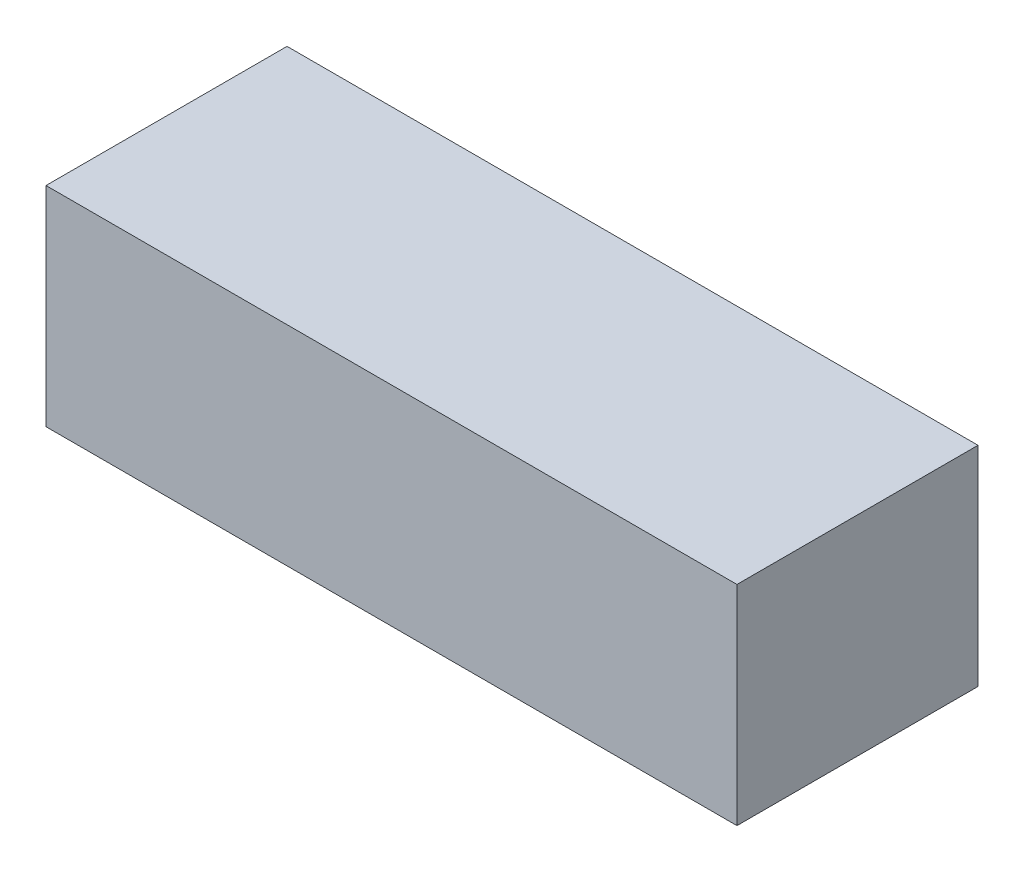
ISO-10303-21;
HEADER;
FILE_DESCRIPTION(('STEP AP214'),'2;1');
FILE_NAME('part.step','',(''),(''),'','','');
FILE_SCHEMA(('AUTOMOTIVE_DESIGN { 1 0 10303 214 1 1 1 1 }'));
ENDSEC;
DATA;
#1=APPLICATION_CONTEXT('core data for automotive mechanical design processes');
#2=APPLICATION_PROTOCOL_DEFINITION('international standard','automotive_design',2000,#1);
#3=PRODUCT_CONTEXT('',#1,'mechanical');
#4=PRODUCT('Part','Part','',(#3));
#5=PRODUCT_RELATED_PRODUCT_CATEGORY('part','',(#4));
#6=PRODUCT_DEFINITION_FORMATION('','',#4);
#7=PRODUCT_DEFINITION_CONTEXT('part definition',#1,'design');
#8=PRODUCT_DEFINITION('design','',#6,#7);
#9=PRODUCT_DEFINITION_SHAPE('','',#8);
#10=(LENGTH_UNIT() NAMED_UNIT(*) SI_UNIT(.MILLI.,.METRE.));
#11=(NAMED_UNIT(*) PLANE_ANGLE_UNIT() SI_UNIT($,.RADIAN.));
#12=(NAMED_UNIT(*) SI_UNIT($,.STERADIAN.) SOLID_ANGLE_UNIT());
#13=UNCERTAINTY_MEASURE_WITH_UNIT(LENGTH_MEASURE(1.E-05),#10,'distance_accuracy_value','');
#14=(GEOMETRIC_REPRESENTATION_CONTEXT(3) GLOBAL_UNCERTAINTY_ASSIGNED_CONTEXT((#13)) GLOBAL_UNIT_ASSIGNED_CONTEXT((#10,
#11,#12)) REPRESENTATION_CONTEXT('',''));
#15=CARTESIAN_POINT('',(0.,0.,0.));
#16=DIRECTION('',(0.,0.,1.));
#17=DIRECTION('',(1.,0.,0.));
#18=AXIS2_PLACEMENT_3D('',#15,#16,#17);
#19=CARTESIAN_POINT('',(215.,65.,75.));
#20=DIRECTION('',(-1.,0.,0.));
#21=DIRECTION('',(0.,0.,1.));
#22=AXIS2_PLACEMENT_3D('',#19,#20,#21);
#23=PLANE('',#22);
#24=DIRECTION('',(0.,0.,-1.));
#25=VECTOR('',#24,1.);
#26=CARTESIAN_POINT('',(215.,-65.,75.));
#27=LINE('',#26,#25);
#28=CARTESIAN_POINT('',(215.,-65.,75.));
#29=VERTEX_POINT('',#28);
#30=CARTESIAN_POINT('',(215.,-65.,-75.));
#31=VERTEX_POINT('',#30);
#32=EDGE_CURVE('E102',#29,#31,#27,.T.);
#33=ORIENTED_EDGE('',*,*,#32,.T.);
#34=DIRECTION('',(0.,-1.,0.));
#35=VECTOR('',#34,1.);
#36=CARTESIAN_POINT('',(215.,65.,-75.));
#37=LINE('',#36,#35);
#38=CARTESIAN_POINT('',(215.,65.,-75.));
#39=VERTEX_POINT('',#38);
#40=EDGE_CURVE('E11',#39,#31,#37,.T.);
#41=ORIENTED_EDGE('',*,*,#40,.F.);
#42=DIRECTION('',(0.,0.,-1.));
#43=VECTOR('',#42,1.);
#44=CARTESIAN_POINT('',(215.,65.,75.));
#45=LINE('',#44,#43);
#46=CARTESIAN_POINT('',(215.,65.,75.));
#47=VERTEX_POINT('',#46);
#48=EDGE_CURVE('E90',#47,#39,#45,.T.);
#49=ORIENTED_EDGE('',*,*,#48,.F.);
#50=DIRECTION('',(0.,-1.,0.));
#51=VECTOR('',#50,1.);
#52=CARTESIAN_POINT('',(215.,65.,75.));
#53=LINE('',#52,#51);
#54=EDGE_CURVE('E98',#47,#29,#53,.T.);
#55=ORIENTED_EDGE('',*,*,#54,.T.);
#56=EDGE_LOOP('',(#33,#41,#49,#55));
#57=FACE_BOUND('',#56,.T.);
#58=ADVANCED_FACE('F39',(#57),#23,.F.);
#59=CARTESIAN_POINT('',(-215.,65.,-75.));
#60=DIRECTION('',(0.,0.,1.));
#61=DIRECTION('',(1.,0.,0.));
#62=AXIS2_PLACEMENT_3D('',#59,#60,#61);
#63=PLANE('',#62);
#64=DIRECTION('',(-1.,0.,0.));
#65=VECTOR('',#64,1.);
#66=CARTESIAN_POINT('',(-215.,-65.,-75.));
#67=LINE('',#66,#65);
#68=CARTESIAN_POINT('',(-215.,-65.,-75.));
#69=VERTEX_POINT('',#68);
#70=EDGE_CURVE('E94',#31,#69,#67,.T.);
#71=ORIENTED_EDGE('',*,*,#70,.T.);
#72=DIRECTION('',(0.,-1.,0.));
#73=VECTOR('',#72,1.);
#74=CARTESIAN_POINT('',(-215.,65.,-75.));
#75=LINE('',#74,#73);
#76=CARTESIAN_POINT('',(-215.,65.,-75.));
#77=VERTEX_POINT('',#76);
#78=EDGE_CURVE('E47',#77,#69,#75,.T.);
#79=ORIENTED_EDGE('',*,*,#78,.F.);
#80=DIRECTION('',(-1.,0.,0.));
#81=VECTOR('',#80,1.);
#82=CARTESIAN_POINT('',(-215.,65.,-75.));
#83=LINE('',#82,#81);
#84=EDGE_CURVE('E85',#39,#77,#83,.T.);
#85=ORIENTED_EDGE('',*,*,#84,.F.);
#86=ORIENTED_EDGE('',*,*,#40,.T.);
#87=EDGE_LOOP('',(#71,#79,#85,#86));
#88=FACE_BOUND('',#87,.T.);
#89=ADVANCED_FACE('F93',(#88),#63,.F.);
#90=CARTESIAN_POINT('',(-215.,65.,75.));
#91=DIRECTION('',(1.,0.,0.));
#92=DIRECTION('',(0.,0.,-1.));
#93=AXIS2_PLACEMENT_3D('',#90,#91,#92);
#94=PLANE('',#93);
#95=DIRECTION('',(0.,0.,1.));
#96=VECTOR('',#95,1.);
#97=CARTESIAN_POINT('',(-215.,-65.,75.));
#98=LINE('',#97,#96);
#99=CARTESIAN_POINT('',(-215.,-65.,75.));
#100=VERTEX_POINT('',#99);
#101=EDGE_CURVE('E72',#69,#100,#98,.T.);
#102=ORIENTED_EDGE('',*,*,#101,.T.);
#103=DIRECTION('',(0.,-1.,0.));
#104=VECTOR('',#103,1.);
#105=CARTESIAN_POINT('',(-215.,65.,75.));
#106=LINE('',#105,#104);
#107=CARTESIAN_POINT('',(-215.,65.,75.));
#108=VERTEX_POINT('',#107);
#109=EDGE_CURVE('E95',#108,#100,#106,.T.);
#110=ORIENTED_EDGE('',*,*,#109,.F.);
#111=DIRECTION('',(0.,0.,1.));
#112=VECTOR('',#111,1.);
#113=CARTESIAN_POINT('',(-215.,65.,75.));
#114=LINE('',#113,#112);
#115=EDGE_CURVE('E88',#77,#108,#114,.T.);
#116=ORIENTED_EDGE('',*,*,#115,.F.);
#117=ORIENTED_EDGE('',*,*,#78,.T.);
#118=EDGE_LOOP('',(#102,#110,#116,#117));
#119=FACE_BOUND('',#118,.T.);
#120=ADVANCED_FACE('F96',(#119),#94,.F.);
#121=CARTESIAN_POINT('',(-215.,65.,75.));
#122=DIRECTION('',(0.,0.,-1.));
#123=DIRECTION('',(-1.,0.,0.));
#124=AXIS2_PLACEMENT_3D('',#121,#122,#123);
#125=PLANE('',#124);
#126=DIRECTION('',(1.,0.,0.));
#127=VECTOR('',#126,1.);
#128=CARTESIAN_POINT('',(-215.,-65.,75.));
#129=LINE('',#128,#127);
#130=EDGE_CURVE('E78',#100,#29,#129,.T.);
#131=ORIENTED_EDGE('',*,*,#130,.T.);
#132=ORIENTED_EDGE('',*,*,#54,.F.);
#133=DIRECTION('',(1.,0.,0.));
#134=VECTOR('',#133,1.);
#135=CARTESIAN_POINT('',(-215.,65.,75.));
#136=LINE('',#135,#134);
#137=EDGE_CURVE('E55',#108,#47,#136,.T.);
#138=ORIENTED_EDGE('',*,*,#137,.F.);
#139=ORIENTED_EDGE('',*,*,#109,.T.);
#140=EDGE_LOOP('',(#131,#132,#138,#139));
#141=FACE_BOUND('',#140,.T.);
#142=ADVANCED_FACE('F109',(#141),#125,.F.);
#143=CARTESIAN_POINT('',(0.,65.,0.));
#144=DIRECTION('',(0.,-1.,0.));
#145=DIRECTION('',(0.,0.,-1.));
#146=AXIS2_PLACEMENT_3D('',#143,#144,#145);
#147=PLANE('',#146);
#148=ORIENTED_EDGE('',*,*,#48,.T.);
#149=ORIENTED_EDGE('',*,*,#84,.T.);
#150=ORIENTED_EDGE('',*,*,#115,.T.);
#151=ORIENTED_EDGE('',*,*,#137,.T.);
#152=EDGE_LOOP('',(#148,#149,#150,#151));
#153=FACE_BOUND('',#152,.T.);
#154=ADVANCED_FACE('F86',(#153),#147,.F.);
#155=CARTESIAN_POINT('',(0.,-65.,0.));
#156=DIRECTION('',(0.,-1.,0.));
#157=DIRECTION('',(0.,0.,-1.));
#158=AXIS2_PLACEMENT_3D('',#155,#156,#157);
#159=PLANE('',#158);
#160=ORIENTED_EDGE('',*,*,#32,.F.);
#161=ORIENTED_EDGE('',*,*,#130,.F.);
#162=ORIENTED_EDGE('',*,*,#101,.F.);
#163=ORIENTED_EDGE('',*,*,#70,.F.);
#164=EDGE_LOOP('',(#160,#161,#162,#163));
#165=FACE_BOUND('',#164,.T.);
#166=ADVANCED_FACE('F112',(#165),#159,.T.);
#167=CLOSED_SHELL('',(#58,#89,#120,#142,#154,#166));
#168=MANIFOLD_SOLID_BREP('B2',#167);
#169=ADVANCED_BREP_SHAPE_REPRESENTATION('',(#18,#168),#14);
#170=SHAPE_DEFINITION_REPRESENTATION(#9,#169);
ENDSEC;
END-ISO-10303-21;
